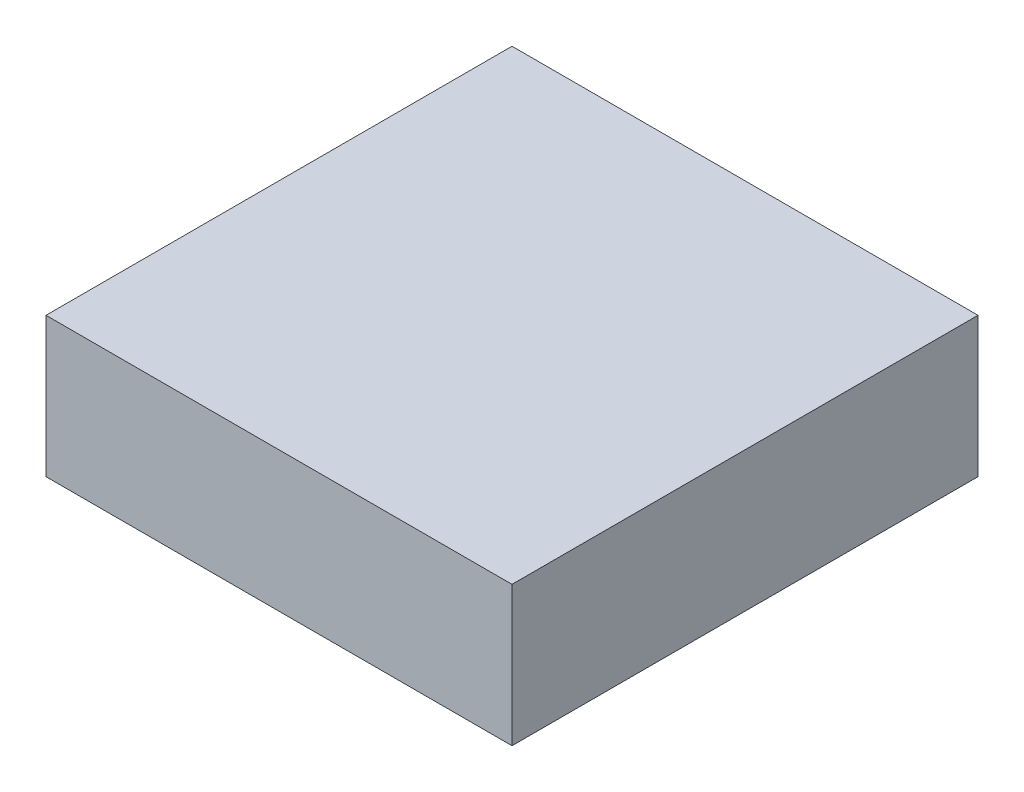
ISO-10303-21;
HEADER;
FILE_DESCRIPTION(('STEP AP214'),'2;1');
FILE_NAME('part.step','',(''),(''),'','','');
FILE_SCHEMA(('AUTOMOTIVE_DESIGN { 1 0 10303 214 1 1 1 1 }'));
ENDSEC;
DATA;
#1=APPLICATION_CONTEXT('core data for automotive mechanical design processes');
#2=APPLICATION_PROTOCOL_DEFINITION('international standard','automotive_design',2000,#1);
#3=PRODUCT_CONTEXT('',#1,'mechanical');
#4=PRODUCT('Part','Part','',(#3));
#5=PRODUCT_RELATED_PRODUCT_CATEGORY('part','',(#4));
#6=PRODUCT_DEFINITION_FORMATION('','',#4);
#7=PRODUCT_DEFINITION_CONTEXT('part definition',#1,'design');
#8=PRODUCT_DEFINITION('design','',#6,#7);
#9=PRODUCT_DEFINITION_SHAPE('','',#8);
#10=(LENGTH_UNIT() NAMED_UNIT(*) SI_UNIT(.MILLI.,.METRE.));
#11=(NAMED_UNIT(*) PLANE_ANGLE_UNIT() SI_UNIT($,.RADIAN.));
#12=(NAMED_UNIT(*) SI_UNIT($,.STERADIAN.) SOLID_ANGLE_UNIT());
#13=UNCERTAINTY_MEASURE_WITH_UNIT(LENGTH_MEASURE(1.E-05),#10,'distance_accuracy_value','');
#14=(GEOMETRIC_REPRESENTATION_CONTEXT(3) GLOBAL_UNCERTAINTY_ASSIGNED_CONTEXT((#13)) GLOBAL_UNIT_ASSIGNED_CONTEXT((#10,
#11,#12)) REPRESENTATION_CONTEXT('',''));
#15=CARTESIAN_POINT('',(0.,0.,0.));
#16=DIRECTION('',(0.,0.,1.));
#17=DIRECTION('',(1.,0.,0.));
#18=AXIS2_PLACEMENT_3D('',#15,#16,#17);
#19=CARTESIAN_POINT('',(0.,6.,-20.));
#20=DIRECTION('',(0.,0.,-1.));
#21=DIRECTION('',(-1.,0.,0.));
#22=AXIS2_PLACEMENT_3D('',#19,#20,#21);
#23=PLANE('',#22);
#24=DIRECTION('',(1.,0.,0.));
#25=VECTOR('',#24,1.);
#26=CARTESIAN_POINT('',(0.,0.,-20.));
#27=LINE('',#26,#25);
#28=CARTESIAN_POINT('',(0.,0.,-20.));
#29=VERTEX_POINT('',#28);
#30=CARTESIAN_POINT('',(20.,0.,-20.));
#31=VERTEX_POINT('',#30);
#32=EDGE_CURVE('E97',#29,#31,#27,.T.);
#33=ORIENTED_EDGE('',*,*,#32,.F.);
#34=DIRECTION('',(0.,-1.,0.));
#35=VECTOR('',#34,1.);
#36=CARTESIAN_POINT('',(0.,6.,-20.));
#37=LINE('',#36,#35);
#38=CARTESIAN_POINT('',(0.,6.,-20.));
#39=VERTEX_POINT('',#38);
#40=EDGE_CURVE('E11',#39,#29,#37,.T.);
#41=ORIENTED_EDGE('',*,*,#40,.F.);
#42=DIRECTION('',(1.,0.,0.));
#43=VECTOR('',#42,1.);
#44=CARTESIAN_POINT('',(0.,6.,-20.));
#45=LINE('',#44,#43);
#46=CARTESIAN_POINT('',(20.,6.,-20.));
#47=VERTEX_POINT('',#46);
#48=EDGE_CURVE('E91',#39,#47,#45,.T.);
#49=ORIENTED_EDGE('',*,*,#48,.T.);
#50=DIRECTION('',(0.,-1.,0.));
#51=VECTOR('',#50,1.);
#52=CARTESIAN_POINT('',(20.,6.,-20.));
#53=LINE('',#52,#51);
#54=EDGE_CURVE('E36',#47,#31,#53,.T.);
#55=ORIENTED_EDGE('',*,*,#54,.T.);
#56=EDGE_LOOP('',(#33,#41,#49,#55));
#57=FACE_BOUND('',#56,.T.);
#58=ADVANCED_FACE('F33',(#57),#23,.T.);
#59=CARTESIAN_POINT('',(0.,6.,0.));
#60=DIRECTION('',(-1.,0.,0.));
#61=DIRECTION('',(0.,0.,1.));
#62=AXIS2_PLACEMENT_3D('',#59,#60,#61);
#63=PLANE('',#62);
#64=DIRECTION('',(0.,0.,-1.));
#65=VECTOR('',#64,1.);
#66=CARTESIAN_POINT('',(0.,0.,0.));
#67=LINE('',#66,#65);
#68=CARTESIAN_POINT('',(0.,0.,0.));
#69=VERTEX_POINT('',#68);
#70=EDGE_CURVE('E93',#69,#29,#67,.T.);
#71=ORIENTED_EDGE('',*,*,#70,.F.);
#72=DIRECTION('',(0.,-1.,0.));
#73=VECTOR('',#72,1.);
#74=CARTESIAN_POINT('',(0.,6.,0.));
#75=LINE('',#74,#73);
#76=CARTESIAN_POINT('',(0.,6.,0.));
#77=VERTEX_POINT('',#76);
#78=EDGE_CURVE('E42',#77,#69,#75,.T.);
#79=ORIENTED_EDGE('',*,*,#78,.F.);
#80=DIRECTION('',(0.,0.,-1.));
#81=VECTOR('',#80,1.);
#82=CARTESIAN_POINT('',(0.,6.,0.));
#83=LINE('',#82,#81);
#84=EDGE_CURVE('E81',#77,#39,#83,.T.);
#85=ORIENTED_EDGE('',*,*,#84,.T.);
#86=ORIENTED_EDGE('',*,*,#40,.T.);
#87=EDGE_LOOP('',(#71,#79,#85,#86));
#88=FACE_BOUND('',#87,.T.);
#89=ADVANCED_FACE('F107',(#88),#63,.T.);
#90=CARTESIAN_POINT('',(0.,6.,0.));
#91=DIRECTION('',(0.,0.,-1.));
#92=DIRECTION('',(-1.,0.,0.));
#93=AXIS2_PLACEMENT_3D('',#90,#91,#92);
#94=PLANE('',#93);
#95=DIRECTION('',(1.,0.,0.));
#96=VECTOR('',#95,1.);
#97=CARTESIAN_POINT('',(0.,0.,0.));
#98=LINE('',#97,#96);
#99=CARTESIAN_POINT('',(20.,0.,0.));
#100=VERTEX_POINT('',#99);
#101=EDGE_CURVE('E86',#69,#100,#98,.T.);
#102=ORIENTED_EDGE('',*,*,#101,.T.);
#103=DIRECTION('',(0.,-1.,0.));
#104=VECTOR('',#103,1.);
#105=CARTESIAN_POINT('',(20.,6.,0.));
#106=LINE('',#105,#104);
#107=CARTESIAN_POINT('',(20.,6.,0.));
#108=VERTEX_POINT('',#107);
#109=EDGE_CURVE('E84',#108,#100,#106,.T.);
#110=ORIENTED_EDGE('',*,*,#109,.F.);
#111=DIRECTION('',(1.,0.,0.));
#112=VECTOR('',#111,1.);
#113=CARTESIAN_POINT('',(0.,6.,0.));
#114=LINE('',#113,#112);
#115=EDGE_CURVE('E78',#77,#108,#114,.T.);
#116=ORIENTED_EDGE('',*,*,#115,.F.);
#117=ORIENTED_EDGE('',*,*,#78,.T.);
#118=EDGE_LOOP('',(#102,#110,#116,#117));
#119=FACE_BOUND('',#118,.T.);
#120=ADVANCED_FACE('F85',(#119),#94,.F.);
#121=CARTESIAN_POINT('',(20.,6.,0.));
#122=DIRECTION('',(-1.,0.,0.));
#123=DIRECTION('',(0.,0.,1.));
#124=AXIS2_PLACEMENT_3D('',#121,#122,#123);
#125=PLANE('',#124);
#126=DIRECTION('',(0.,0.,-1.));
#127=VECTOR('',#126,1.);
#128=CARTESIAN_POINT('',(20.,0.,0.));
#129=LINE('',#128,#127);
#130=EDGE_CURVE('E100',#100,#31,#129,.T.);
#131=ORIENTED_EDGE('',*,*,#130,.T.);
#132=ORIENTED_EDGE('',*,*,#54,.F.);
#133=DIRECTION('',(0.,0.,-1.));
#134=VECTOR('',#133,1.);
#135=CARTESIAN_POINT('',(20.,6.,0.));
#136=LINE('',#135,#134);
#137=EDGE_CURVE('E75',#108,#47,#136,.T.);
#138=ORIENTED_EDGE('',*,*,#137,.F.);
#139=ORIENTED_EDGE('',*,*,#109,.T.);
#140=EDGE_LOOP('',(#131,#132,#138,#139));
#141=FACE_BOUND('',#140,.T.);
#142=ADVANCED_FACE('F90',(#141),#125,.F.);
#143=CARTESIAN_POINT('',(0.,6.,0.));
#144=DIRECTION('',(0.,1.,0.));
#145=DIRECTION('',(0.,0.,1.));
#146=AXIS2_PLACEMENT_3D('',#143,#144,#145);
#147=PLANE('',#146);
#148=ORIENTED_EDGE('',*,*,#48,.F.);
#149=ORIENTED_EDGE('',*,*,#84,.F.);
#150=ORIENTED_EDGE('',*,*,#115,.T.);
#151=ORIENTED_EDGE('',*,*,#137,.T.);
#152=EDGE_LOOP('',(#148,#149,#150,#151));
#153=FACE_BOUND('',#152,.T.);
#154=ADVANCED_FACE('F80',(#153),#147,.T.);
#155=CARTESIAN_POINT('',(0.,0.,0.));
#156=DIRECTION('',(0.,1.,0.));
#157=DIRECTION('',(0.,0.,1.));
#158=AXIS2_PLACEMENT_3D('',#155,#156,#157);
#159=PLANE('',#158);
#160=ORIENTED_EDGE('',*,*,#32,.T.);
#161=ORIENTED_EDGE('',*,*,#130,.F.);
#162=ORIENTED_EDGE('',*,*,#101,.F.);
#163=ORIENTED_EDGE('',*,*,#70,.T.);
#164=EDGE_LOOP('',(#160,#161,#162,#163));
#165=FACE_BOUND('',#164,.T.);
#166=ADVANCED_FACE('F106',(#165),#159,.F.);
#167=CLOSED_SHELL('',(#58,#89,#120,#142,#154,#166));
#168=MANIFOLD_SOLID_BREP('B2',#167);
#169=ADVANCED_BREP_SHAPE_REPRESENTATION('',(#18,#168),#14);
#170=SHAPE_DEFINITION_REPRESENTATION(#9,#169);
ENDSEC;
END-ISO-10303-21;
